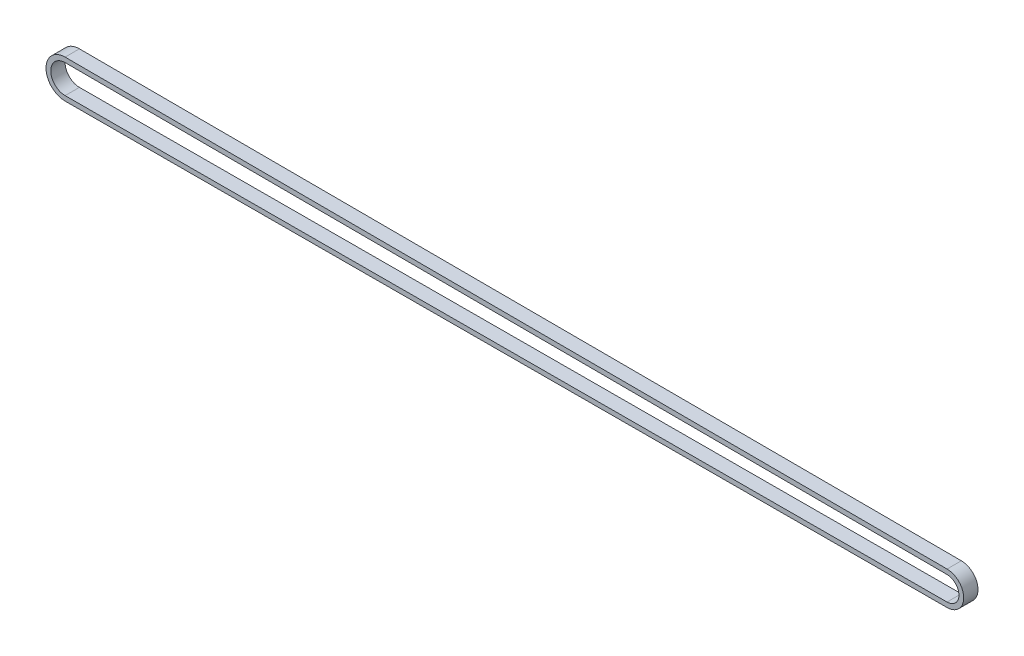
ISO-10303-21;
HEADER;
FILE_DESCRIPTION(('STEP AP214'),'2;1');
FILE_NAME('part.step','',(''),(''),'','','');
FILE_SCHEMA(('AUTOMOTIVE_DESIGN { 1 0 10303 214 1 1 1 1 }'));
ENDSEC;
DATA;
#1=APPLICATION_CONTEXT('core data for automotive mechanical design processes');
#2=APPLICATION_PROTOCOL_DEFINITION('international standard','automotive_design',2000,#1);
#3=PRODUCT_CONTEXT('',#1,'mechanical');
#4=PRODUCT('Part','Part','',(#3));
#5=PRODUCT_RELATED_PRODUCT_CATEGORY('part','',(#4));
#6=PRODUCT_DEFINITION_FORMATION('','',#4);
#7=PRODUCT_DEFINITION_CONTEXT('part definition',#1,'design');
#8=PRODUCT_DEFINITION('design','',#6,#7);
#9=PRODUCT_DEFINITION_SHAPE('','',#8);
#10=(LENGTH_UNIT() NAMED_UNIT(*) SI_UNIT(.MILLI.,.METRE.));
#11=(NAMED_UNIT(*) PLANE_ANGLE_UNIT() SI_UNIT($,.RADIAN.));
#12=(NAMED_UNIT(*) SI_UNIT($,.STERADIAN.) SOLID_ANGLE_UNIT());
#13=UNCERTAINTY_MEASURE_WITH_UNIT(LENGTH_MEASURE(1.E-05),#10,'distance_accuracy_value','');
#14=(GEOMETRIC_REPRESENTATION_CONTEXT(3) GLOBAL_UNCERTAINTY_ASSIGNED_CONTEXT((#13)) GLOBAL_UNIT_ASSIGNED_CONTEXT((#10,
#11,#12)) REPRESENTATION_CONTEXT('',''));
#15=CARTESIAN_POINT('',(0.,0.,0.));
#16=DIRECTION('',(0.,0.,1.));
#17=DIRECTION('',(1.,0.,0.));
#18=AXIS2_PLACEMENT_3D('',#15,#16,#17);
#19=CARTESIAN_POINT('',(-370.,0.,6.));
#20=DIRECTION('',(0.,0.,1.));
#21=DIRECTION('',(1.,0.,0.));
#22=AXIS2_PLACEMENT_3D('',#19,#20,#21);
#23=PLANE('',#22);
#24=CARTESIAN_POINT('',(-370.,0.,6.));
#25=DIRECTION('',(0.,0.,1.));
#26=DIRECTION('',(1.,0.,0.));
#27=AXIS2_PLACEMENT_3D('',#24,#25,#26);
#28=CIRCLE('',#27,8.);
#29=CARTESIAN_POINT('',(-369.978378378378,7.999970781539,6.));
#30=VERTEX_POINT('',#29);
#31=CARTESIAN_POINT('',(-369.978378378378,-7.99997078153909,6.));
#32=VERTEX_POINT('',#31);
#33=EDGE_CURVE('E134',#30,#32,#28,.T.);
#34=ORIENTED_EDGE('',*,*,#33,.T.);
#35=DIRECTION('',(0.999996347692381,0.00270270270270282,0.));
#36=VECTOR('',#35,1.);
#37=CARTESIAN_POINT('',(-369.978378378378,-7.99997078153909,6.));
#38=LINE('',#37,#36);
#39=CARTESIAN_POINT('',(0.0189189189189212,-6.99997443384666,6.));
#40=VERTEX_POINT('',#39);
#41=EDGE_CURVE('E137',#32,#40,#38,.T.);
#42=ORIENTED_EDGE('',*,*,#41,.T.);
#43=CARTESIAN_POINT('',(0.,0.,6.));
#44=DIRECTION('',(0.,0.,1.));
#45=DIRECTION('',(-1.,0.,0.));
#46=AXIS2_PLACEMENT_3D('',#43,#44,#45);
#47=CIRCLE('',#46,7.);
#48=CARTESIAN_POINT('',(0.0189189189189907,6.99997443384666,6.));
#49=VERTEX_POINT('',#48);
#50=EDGE_CURVE('E140',#40,#49,#47,.T.);
#51=ORIENTED_EDGE('',*,*,#50,.T.);
#52=DIRECTION('',(-0.999996347692381,0.00270270270270258,0.));
#53=VECTOR('',#52,1.);
#54=CARTESIAN_POINT('',(-369.978378378378,7.999970781539,6.));
#55=LINE('',#54,#53);
#56=EDGE_CURVE('E142',#49,#30,#55,.T.);
#57=ORIENTED_EDGE('',*,*,#56,.T.);
#58=EDGE_LOOP('',(#34,#42,#51,#57));
#59=FACE_BOUND('',#58,.T.);
#60=DIRECTION('',(0.999996347692381,0.00270270270270283,0.));
#61=VECTOR('',#60,1.);
#62=CARTESIAN_POINT('',(-369.983783783784,-5.99997808615433,6.));
#63=LINE('',#62,#61);
#64=CARTESIAN_POINT('',(-369.983783783784,-5.99997808615433,6.));
#65=VERTEX_POINT('',#64);
#66=CARTESIAN_POINT('',(0.0135135135135151,-4.9999817384619,6.));
#67=VERTEX_POINT('',#66);
#68=EDGE_CURVE('E106',#65,#67,#63,.T.);
#69=ORIENTED_EDGE('',*,*,#68,.F.);
#70=CARTESIAN_POINT('',(-370.,0.,6.));
#71=DIRECTION('',(0.,0.,1.));
#72=DIRECTION('',(1.,0.,0.));
#73=AXIS2_PLACEMENT_3D('',#70,#71,#72);
#74=CIRCLE('',#73,6.);
#75=CARTESIAN_POINT('',(-369.983783783784,5.99997808615424,6.));
#76=VERTEX_POINT('',#75);
#77=EDGE_CURVE('E98',#76,#65,#74,.T.);
#78=ORIENTED_EDGE('',*,*,#77,.F.);
#79=DIRECTION('',(-0.999996347692381,0.00270270270270258,0.));
#80=VECTOR('',#79,1.);
#81=CARTESIAN_POINT('',(-369.983783783784,5.99997808615424,6.));
#82=LINE('',#81,#80);
#83=CARTESIAN_POINT('',(0.0135135135134745,4.9999817384619,6.));
#84=VERTEX_POINT('',#83);
#85=EDGE_CURVE('E120',#84,#76,#82,.T.);
#86=ORIENTED_EDGE('',*,*,#85,.F.);
#87=CARTESIAN_POINT('',(0.,0.,6.));
#88=DIRECTION('',(0.,0.,1.));
#89=DIRECTION('',(-1.,0.,0.));
#90=AXIS2_PLACEMENT_3D('',#87,#88,#89);
#91=CIRCLE('',#90,5.);
#92=EDGE_CURVE('E118',#67,#84,#91,.T.);
#93=ORIENTED_EDGE('',*,*,#92,.F.);
#94=EDGE_LOOP('',(#69,#78,#86,#93));
#95=FACE_BOUND('',#94,.T.);
#96=ADVANCED_FACE('F33',(#59,#95),#23,.T.);
#97=CARTESIAN_POINT('',(-370.,0.,0.));
#98=DIRECTION('',(0.,0.,1.));
#99=DIRECTION('',(1.,0.,0.));
#100=AXIS2_PLACEMENT_3D('',#97,#98,#99);
#101=PLANE('',#100);
#102=CARTESIAN_POINT('',(-370.,0.,0.));
#103=DIRECTION('',(0.,0.,1.));
#104=DIRECTION('',(1.,0.,0.));
#105=AXIS2_PLACEMENT_3D('',#102,#103,#104);
#106=CIRCLE('',#105,8.);
#107=CARTESIAN_POINT('',(-369.978378378378,7.999970781539,0.));
#108=VERTEX_POINT('',#107);
#109=CARTESIAN_POINT('',(-369.978378378378,-7.99997078153909,0.));
#110=VERTEX_POINT('',#109);
#111=EDGE_CURVE('E114',#108,#110,#106,.T.);
#112=ORIENTED_EDGE('',*,*,#111,.F.);
#113=DIRECTION('',(-0.999996347692381,0.00270270270270258,0.));
#114=VECTOR('',#113,1.);
#115=CARTESIAN_POINT('',(-369.978378378378,7.999970781539,0.));
#116=LINE('',#115,#114);
#117=CARTESIAN_POINT('',(0.0189189189189907,6.99997443384666,0.));
#118=VERTEX_POINT('',#117);
#119=EDGE_CURVE('E138',#118,#108,#116,.T.);
#120=ORIENTED_EDGE('',*,*,#119,.F.);
#121=CARTESIAN_POINT('',(0.,0.,0.));
#122=DIRECTION('',(0.,0.,1.));
#123=DIRECTION('',(-1.,0.,0.));
#124=AXIS2_PLACEMENT_3D('',#121,#122,#123);
#125=CIRCLE('',#124,7.);
#126=CARTESIAN_POINT('',(0.0189189189189212,-6.99997443384666,0.));
#127=VERTEX_POINT('',#126);
#128=EDGE_CURVE('E149',#127,#118,#125,.T.);
#129=ORIENTED_EDGE('',*,*,#128,.F.);
#130=DIRECTION('',(0.999996347692381,0.00270270270270282,0.));
#131=VECTOR('',#130,1.);
#132=CARTESIAN_POINT('',(-369.978378378378,-7.99997078153909,0.));
#133=LINE('',#132,#131);
#134=EDGE_CURVE('E147',#110,#127,#133,.T.);
#135=ORIENTED_EDGE('',*,*,#134,.F.);
#136=EDGE_LOOP('',(#112,#120,#129,#135));
#137=FACE_BOUND('',#136,.T.);
#138=CARTESIAN_POINT('',(-370.,0.,0.));
#139=DIRECTION('',(0.,0.,1.));
#140=DIRECTION('',(1.,0.,0.));
#141=AXIS2_PLACEMENT_3D('',#138,#139,#140);
#142=CIRCLE('',#141,6.);
#143=CARTESIAN_POINT('',(-369.983783783784,5.99997808615424,0.));
#144=VERTEX_POINT('',#143);
#145=CARTESIAN_POINT('',(-369.983783783784,-5.99997808615433,0.));
#146=VERTEX_POINT('',#145);
#147=EDGE_CURVE('E56',#144,#146,#142,.T.);
#148=ORIENTED_EDGE('',*,*,#147,.T.);
#149=DIRECTION('',(0.999996347692381,0.00270270270270283,0.));
#150=VECTOR('',#149,1.);
#151=CARTESIAN_POINT('',(-369.983783783784,-5.99997808615433,0.));
#152=LINE('',#151,#150);
#153=CARTESIAN_POINT('',(0.0135135135135151,-4.9999817384619,0.));
#154=VERTEX_POINT('',#153);
#155=EDGE_CURVE('E113',#146,#154,#152,.T.);
#156=ORIENTED_EDGE('',*,*,#155,.T.);
#157=CARTESIAN_POINT('',(0.,0.,0.));
#158=DIRECTION('',(0.,0.,1.));
#159=DIRECTION('',(-1.,0.,0.));
#160=AXIS2_PLACEMENT_3D('',#157,#158,#159);
#161=CIRCLE('',#160,5.);
#162=CARTESIAN_POINT('',(0.0135135135135132,4.9999817384619,0.));
#163=VERTEX_POINT('',#162);
#164=EDGE_CURVE('E126',#154,#163,#161,.T.);
#165=ORIENTED_EDGE('',*,*,#164,.T.);
#166=DIRECTION('',(-0.999996347692381,0.00270270270270258,0.));
#167=VECTOR('',#166,1.);
#168=CARTESIAN_POINT('',(-369.983783783784,5.99997808615424,0.));
#169=LINE('',#168,#167);
#170=EDGE_CURVE('E107',#163,#144,#169,.T.);
#171=ORIENTED_EDGE('',*,*,#170,.T.);
#172=EDGE_LOOP('',(#148,#156,#165,#171));
#173=FACE_BOUND('',#172,.T.);
#174=ADVANCED_FACE('F167',(#137,#173),#101,.F.);
#175=CARTESIAN_POINT('',(-370.,0.,6.));
#176=DIRECTION('',(0.,0.,-1.));
#177=DIRECTION('',(-1.,0.,0.));
#178=AXIS2_PLACEMENT_3D('',#175,#176,#177);
#179=CYLINDRICAL_SURFACE('',#178,8.);
#180=ORIENTED_EDGE('',*,*,#111,.T.);
#181=DIRECTION('',(0.,0.,-1.));
#182=VECTOR('',#181,1.);
#183=CARTESIAN_POINT('',(-369.978378378378,-7.99997078153909,6.));
#184=LINE('',#183,#182);
#185=EDGE_CURVE('E11',#32,#110,#184,.T.);
#186=ORIENTED_EDGE('',*,*,#185,.F.);
#187=ORIENTED_EDGE('',*,*,#33,.F.);
#188=DIRECTION('',(0.,0.,-1.));
#189=VECTOR('',#188,1.);
#190=CARTESIAN_POINT('',(-369.978378378378,7.999970781539,6.));
#191=LINE('',#190,#189);
#192=EDGE_CURVE('E144',#30,#108,#191,.T.);
#193=ORIENTED_EDGE('',*,*,#192,.T.);
#194=EDGE_LOOP('',(#180,#186,#187,#193));
#195=FACE_BOUND('',#194,.T.);
#196=ADVANCED_FACE('F35',(#195),#179,.T.);
#197=CARTESIAN_POINT('',(-369.978378378378,-7.99997078153909,6.));
#198=DIRECTION('',(-0.00270270270270282,0.999996347692381,0.));
#199=DIRECTION('',(-0.999996347692381,-0.00270270270270282,0.));
#200=AXIS2_PLACEMENT_3D('',#197,#198,#199);
#201=PLANE('',#200);
#202=ORIENTED_EDGE('',*,*,#134,.T.);
#203=DIRECTION('',(0.,0.,-1.));
#204=VECTOR('',#203,1.);
#205=CARTESIAN_POINT('',(0.0189189189189212,-6.99997443384666,6.));
#206=LINE('',#205,#204);
#207=EDGE_CURVE('E41',#40,#127,#206,.T.);
#208=ORIENTED_EDGE('',*,*,#207,.F.);
#209=ORIENTED_EDGE('',*,*,#41,.F.);
#210=ORIENTED_EDGE('',*,*,#185,.T.);
#211=EDGE_LOOP('',(#202,#208,#209,#210));
#212=FACE_BOUND('',#211,.T.);
#213=ADVANCED_FACE('F177',(#212),#201,.F.);
#214=CARTESIAN_POINT('',(0.,0.,6.));
#215=DIRECTION('',(0.,0.,-1.));
#216=DIRECTION('',(-1.,0.,0.));
#217=AXIS2_PLACEMENT_3D('',#214,#215,#216);
#218=CYLINDRICAL_SURFACE('',#217,7.);
#219=ORIENTED_EDGE('',*,*,#128,.T.);
#220=DIRECTION('',(0.,0.,-1.));
#221=VECTOR('',#220,1.);
#222=CARTESIAN_POINT('',(0.0189189189189907,6.99997443384666,6.));
#223=LINE('',#222,#221);
#224=EDGE_CURVE('E154',#49,#118,#223,.T.);
#225=ORIENTED_EDGE('',*,*,#224,.F.);
#226=ORIENTED_EDGE('',*,*,#50,.F.);
#227=ORIENTED_EDGE('',*,*,#207,.T.);
#228=EDGE_LOOP('',(#219,#225,#226,#227));
#229=FACE_BOUND('',#228,.T.);
#230=ADVANCED_FACE('F161',(#229),#218,.T.);
#231=CARTESIAN_POINT('',(-369.978378378378,7.999970781539,6.));
#232=DIRECTION('',(-0.00270270270270258,-0.999996347692381,0.));
#233=DIRECTION('',(0.999996347692381,-0.00270270270270258,0.));
#234=AXIS2_PLACEMENT_3D('',#231,#232,#233);
#235=PLANE('',#234);
#236=ORIENTED_EDGE('',*,*,#119,.T.);
#237=ORIENTED_EDGE('',*,*,#192,.F.);
#238=ORIENTED_EDGE('',*,*,#56,.F.);
#239=ORIENTED_EDGE('',*,*,#224,.T.);
#240=EDGE_LOOP('',(#236,#237,#238,#239));
#241=FACE_BOUND('',#240,.T.);
#242=ADVANCED_FACE('F171',(#241),#235,.F.);
#243=CARTESIAN_POINT('',(-370.,0.,6.));
#244=DIRECTION('',(0.,0.,-1.));
#245=DIRECTION('',(-1.,0.,0.));
#246=AXIS2_PLACEMENT_3D('',#243,#244,#245);
#247=CYLINDRICAL_SURFACE('',#246,6.);
#248=ORIENTED_EDGE('',*,*,#147,.F.);
#249=DIRECTION('',(0.,0.,-1.));
#250=VECTOR('',#249,1.);
#251=CARTESIAN_POINT('',(-369.983783783784,5.99997808615424,6.));
#252=LINE('',#251,#250);
#253=EDGE_CURVE('E102',#76,#144,#252,.T.);
#254=ORIENTED_EDGE('',*,*,#253,.F.);
#255=ORIENTED_EDGE('',*,*,#77,.T.);
#256=DIRECTION('',(0.,0.,-1.));
#257=VECTOR('',#256,1.);
#258=CARTESIAN_POINT('',(-369.983783783784,-5.99997808615433,6.));
#259=LINE('',#258,#257);
#260=EDGE_CURVE('E101',#65,#146,#259,.T.);
#261=ORIENTED_EDGE('',*,*,#260,.T.);
#262=EDGE_LOOP('',(#248,#254,#255,#261));
#263=FACE_BOUND('',#262,.T.);
#264=ADVANCED_FACE('F100',(#263),#247,.F.);
#265=CARTESIAN_POINT('',(-369.983783783784,-5.99997808615433,6.));
#266=DIRECTION('',(-0.00270270270270283,0.999996347692381,0.));
#267=DIRECTION('',(-0.999996347692381,-0.00270270270270283,0.));
#268=AXIS2_PLACEMENT_3D('',#265,#266,#267);
#269=PLANE('',#268);
#270=ORIENTED_EDGE('',*,*,#155,.F.);
#271=ORIENTED_EDGE('',*,*,#260,.F.);
#272=ORIENTED_EDGE('',*,*,#68,.T.);
#273=DIRECTION('',(0.,0.,-1.));
#274=VECTOR('',#273,1.);
#275=CARTESIAN_POINT('',(0.0135135135135151,-4.9999817384619,6.));
#276=LINE('',#275,#274);
#277=EDGE_CURVE('E115',#67,#154,#276,.T.);
#278=ORIENTED_EDGE('',*,*,#277,.T.);
#279=EDGE_LOOP('',(#270,#271,#272,#278));
#280=FACE_BOUND('',#279,.T.);
#281=ADVANCED_FACE('F110',(#280),#269,.T.);
#282=CARTESIAN_POINT('',(0.,0.,6.));
#283=DIRECTION('',(0.,0.,-1.));
#284=DIRECTION('',(-1.,0.,0.));
#285=AXIS2_PLACEMENT_3D('',#282,#283,#284);
#286=CYLINDRICAL_SURFACE('',#285,5.);
#287=ORIENTED_EDGE('',*,*,#164,.F.);
#288=ORIENTED_EDGE('',*,*,#277,.F.);
#289=ORIENTED_EDGE('',*,*,#92,.T.);
#290=DIRECTION('',(0.,0.,-1.));
#291=VECTOR('',#290,1.);
#292=CARTESIAN_POINT('',(0.0135135135135132,4.9999817384619,6.));
#293=LINE('',#292,#291);
#294=EDGE_CURVE('E48',#84,#163,#293,.T.);
#295=ORIENTED_EDGE('',*,*,#294,.T.);
#296=EDGE_LOOP('',(#287,#288,#289,#295));
#297=FACE_BOUND('',#296,.T.);
#298=ADVANCED_FACE('F200',(#297),#286,.F.);
#299=CARTESIAN_POINT('',(-369.983783783784,5.99997808615424,6.));
#300=DIRECTION('',(-0.00270270270270258,-0.999996347692381,0.));
#301=DIRECTION('',(0.999996347692381,-0.00270270270270258,0.));
#302=AXIS2_PLACEMENT_3D('',#299,#300,#301);
#303=PLANE('',#302);
#304=ORIENTED_EDGE('',*,*,#170,.F.);
#305=ORIENTED_EDGE('',*,*,#294,.F.);
#306=ORIENTED_EDGE('',*,*,#85,.T.);
#307=ORIENTED_EDGE('',*,*,#253,.T.);
#308=EDGE_LOOP('',(#304,#305,#306,#307));
#309=FACE_BOUND('',#308,.T.);
#310=ADVANCED_FACE('F204',(#309),#303,.T.);
#311=CLOSED_SHELL('',(#96,#174,#196,#213,#230,#242,#264,#281,#298,#310));
#312=MANIFOLD_SOLID_BREP('B2',#311);
#313=ADVANCED_BREP_SHAPE_REPRESENTATION('',(#18,#312),#14);
#314=SHAPE_DEFINITION_REPRESENTATION(#9,#313);
ENDSEC;
END-ISO-10303-21;
